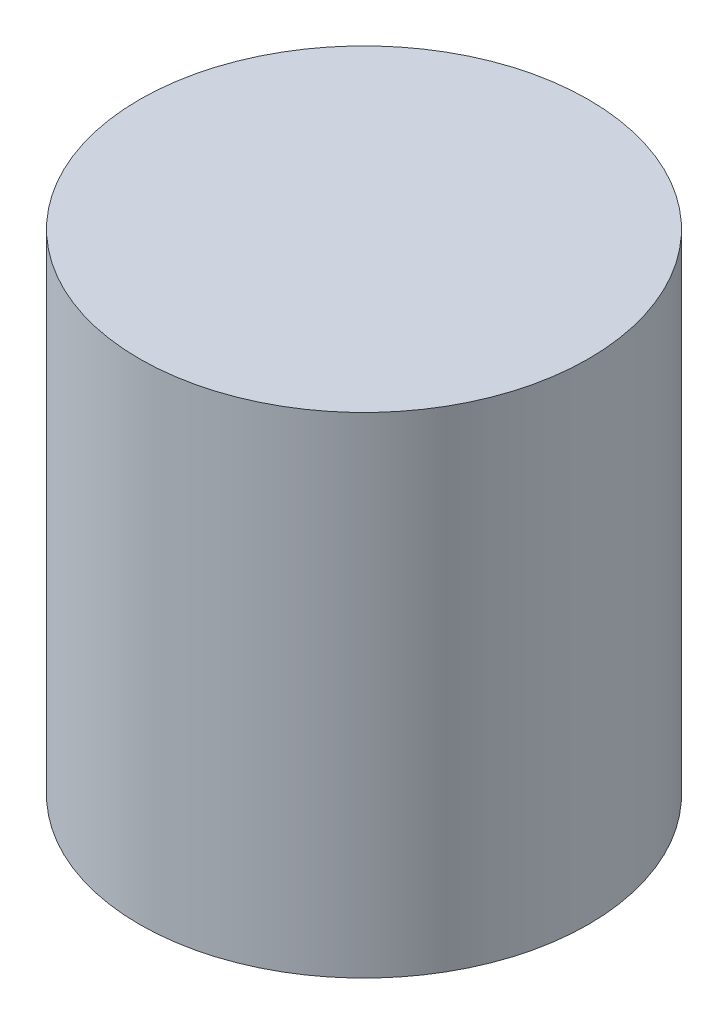
ISO-10303-21;
HEADER;
FILE_DESCRIPTION(('STEP AP214'),'2;1');
FILE_NAME('part.step','',(''),(''),'','','');
FILE_SCHEMA(('AUTOMOTIVE_DESIGN { 1 0 10303 214 1 1 1 1 }'));
ENDSEC;
DATA;
#1=APPLICATION_CONTEXT('core data for automotive mechanical design processes');
#2=APPLICATION_PROTOCOL_DEFINITION('international standard','automotive_design',2000,#1);
#3=PRODUCT_CONTEXT('',#1,'mechanical');
#4=PRODUCT('Part','Part','',(#3));
#5=PRODUCT_RELATED_PRODUCT_CATEGORY('part','',(#4));
#6=PRODUCT_DEFINITION_FORMATION('','',#4);
#7=PRODUCT_DEFINITION_CONTEXT('part definition',#1,'design');
#8=PRODUCT_DEFINITION('design','',#6,#7);
#9=PRODUCT_DEFINITION_SHAPE('','',#8);
#10=(LENGTH_UNIT() NAMED_UNIT(*) SI_UNIT(.MILLI.,.METRE.));
#11=(NAMED_UNIT(*) PLANE_ANGLE_UNIT() SI_UNIT($,.RADIAN.));
#12=(NAMED_UNIT(*) SI_UNIT($,.STERADIAN.) SOLID_ANGLE_UNIT());
#13=UNCERTAINTY_MEASURE_WITH_UNIT(LENGTH_MEASURE(1.E-05),#10,'distance_accuracy_value','');
#14=(GEOMETRIC_REPRESENTATION_CONTEXT(3) GLOBAL_UNCERTAINTY_ASSIGNED_CONTEXT((#13)) GLOBAL_UNIT_ASSIGNED_CONTEXT((#10,
#11,#12)) REPRESENTATION_CONTEXT('',''));
#15=CARTESIAN_POINT('',(0.,0.,0.));
#16=DIRECTION('',(0.,0.,1.));
#17=DIRECTION('',(1.,0.,0.));
#18=AXIS2_PLACEMENT_3D('',#15,#16,#17);
#19=CARTESIAN_POINT('',(0.,12.,0.));
#20=DIRECTION('',(0.,-1.,0.));
#21=DIRECTION('',(0.,0.,-1.));
#22=AXIS2_PLACEMENT_3D('',#19,#20,#21);
#23=CYLINDRICAL_SURFACE('',#22,5.5);
#24=CARTESIAN_POINT('',(0.,12.,0.));
#25=DIRECTION('',(0.,1.,0.));
#26=DIRECTION('',(0.,0.,1.));
#27=AXIS2_PLACEMENT_3D('',#24,#25,#26);
#28=CIRCLE('',#27,5.5);
#29=CARTESIAN_POINT('',(0.,12.,5.5));
#30=VERTEX_POINT('',#29);
#31=EDGE_CURVE('E10',#30,#30,#28,.T.);
#32=ORIENTED_EDGE('',*,*,#31,.F.);
#33=EDGE_LOOP('',(#32));
#34=FACE_BOUND('',#33,.T.);
#35=CARTESIAN_POINT('',(0.,0.,0.));
#36=DIRECTION('',(0.,1.,0.));
#37=DIRECTION('',(0.,0.,1.));
#38=AXIS2_PLACEMENT_3D('',#35,#36,#37);
#39=CIRCLE('',#38,5.5);
#40=CARTESIAN_POINT('',(0.,0.,5.5));
#41=VERTEX_POINT('',#40);
#42=EDGE_CURVE('E35',#41,#41,#39,.T.);
#43=ORIENTED_EDGE('',*,*,#42,.T.);
#44=EDGE_LOOP('',(#43));
#45=FACE_BOUND('',#44,.T.);
#46=ADVANCED_FACE('F32',(#34,#45),#23,.T.);
#47=CARTESIAN_POINT('',(0.,12.,0.));
#48=DIRECTION('',(0.,1.,0.));
#49=DIRECTION('',(0.,0.,1.));
#50=AXIS2_PLACEMENT_3D('',#47,#48,#49);
#51=PLANE('',#50);
#52=ORIENTED_EDGE('',*,*,#31,.T.);
#53=EDGE_LOOP('',(#52));
#54=FACE_BOUND('',#53,.T.);
#55=ADVANCED_FACE('F47',(#54),#51,.T.);
#56=CARTESIAN_POINT('',(0.,0.,0.));
#57=DIRECTION('',(0.,1.,0.));
#58=DIRECTION('',(0.,0.,1.));
#59=AXIS2_PLACEMENT_3D('',#56,#57,#58);
#60=PLANE('',#59);
#61=ORIENTED_EDGE('',*,*,#42,.F.);
#62=EDGE_LOOP('',(#61));
#63=FACE_BOUND('',#62,.T.);
#64=ADVANCED_FACE('F45',(#63),#60,.F.);
#65=CLOSED_SHELL('',(#46,#55,#64));
#66=MANIFOLD_SOLID_BREP('B2',#65);
#67=ADVANCED_BREP_SHAPE_REPRESENTATION('',(#18,#66),#14);
#68=SHAPE_DEFINITION_REPRESENTATION(#9,#67);
ENDSEC;
END-ISO-10303-21;
